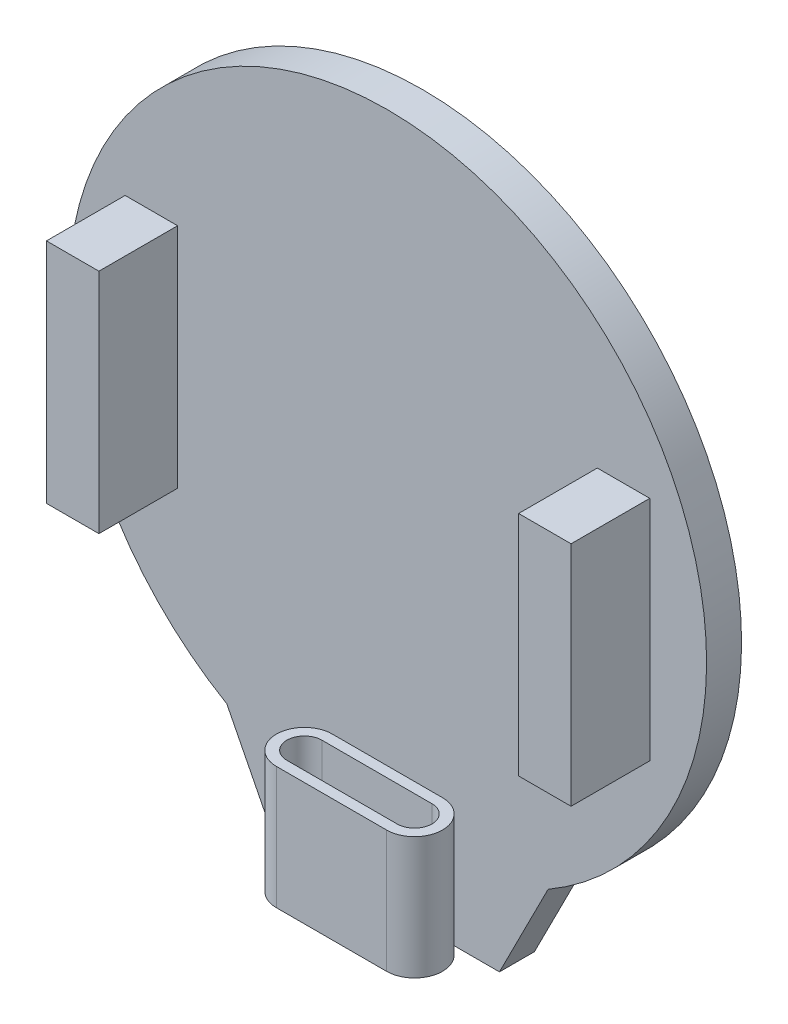
ISO-10303-21;
HEADER;
FILE_DESCRIPTION(('STEP AP214'),'2;1');
FILE_NAME('part.step','',(''),(''),'','','');
FILE_SCHEMA(('AUTOMOTIVE_DESIGN { 1 0 10303 214 1 1 1 1 }'));
ENDSEC;
DATA;
#1=APPLICATION_CONTEXT('core data for automotive mechanical design processes');
#2=APPLICATION_PROTOCOL_DEFINITION('international standard','automotive_design',2000,#1);
#3=PRODUCT_CONTEXT('',#1,'mechanical');
#4=PRODUCT('Part','Part','',(#3));
#5=PRODUCT_RELATED_PRODUCT_CATEGORY('part','',(#4));
#6=PRODUCT_DEFINITION_FORMATION('','',#4);
#7=PRODUCT_DEFINITION_CONTEXT('part definition',#1,'design');
#8=PRODUCT_DEFINITION('design','',#6,#7);
#9=PRODUCT_DEFINITION_SHAPE('','',#8);
#10=(LENGTH_UNIT() NAMED_UNIT(*) SI_UNIT(.MILLI.,.METRE.));
#11=(NAMED_UNIT(*) PLANE_ANGLE_UNIT() SI_UNIT($,.RADIAN.));
#12=(NAMED_UNIT(*) SI_UNIT($,.STERADIAN.) SOLID_ANGLE_UNIT());
#13=UNCERTAINTY_MEASURE_WITH_UNIT(LENGTH_MEASURE(1.E-05),#10,'distance_accuracy_value','');
#14=(GEOMETRIC_REPRESENTATION_CONTEXT(3) GLOBAL_UNCERTAINTY_ASSIGNED_CONTEXT((#13)) GLOBAL_UNIT_ASSIGNED_CONTEXT((#10,
#11,#12)) REPRESENTATION_CONTEXT('',''));
#15=CARTESIAN_POINT('',(0.,0.,0.));
#16=DIRECTION('',(0.,0.,1.));
#17=DIRECTION('',(1.,0.,0.));
#18=AXIS2_PLACEMENT_3D('',#15,#16,#17);
#19=CARTESIAN_POINT('',(0.,0.,2.));
#20=DIRECTION('',(0.,0.,1.));
#21=DIRECTION('',(1.,0.,0.));
#22=AXIS2_PLACEMENT_3D('',#19,#20,#21);
#23=PLANE('',#22);
#24=DIRECTION('',(0.,-1.,0.));
#25=VECTOR('',#24,1.);
#26=CARTESIAN_POINT('',(-3.15,-14.2501704175954,2.));
#27=LINE('',#26,#25);
#28=CARTESIAN_POINT('',(-3.15,-14.2501704175954,2.));
#29=VERTEX_POINT('',#28);
#30=CARTESIAN_POINT('',(-3.15,-21.2501704175954,2.));
#31=VERTEX_POINT('',#30);
#32=EDGE_CURVE('E60',#29,#31,#27,.T.);
#33=ORIENTED_EDGE('',*,*,#32,.F.);
#34=DIRECTION('',(1.,0.,0.));
#35=VECTOR('',#34,1.);
#36=CARTESIAN_POINT('',(-3.15,-14.2501704175954,2.));
#37=LINE('',#36,#35);
#38=CARTESIAN_POINT('',(3.15,-14.2501704175954,2.));
#39=VERTEX_POINT('',#38);
#40=EDGE_CURVE('E55',#29,#39,#37,.T.);
#41=ORIENTED_EDGE('',*,*,#40,.T.);
#42=DIRECTION('',(0.,-1.,0.));
#43=VECTOR('',#42,1.);
#44=CARTESIAN_POINT('',(3.15,-14.2501704175954,2.));
#45=LINE('',#44,#43);
#46=CARTESIAN_POINT('',(3.15,-21.2501704175954,2.));
#47=VERTEX_POINT('',#46);
#48=EDGE_CURVE('E243',#39,#47,#45,.T.);
#49=ORIENTED_EDGE('',*,*,#48,.T.);
#50=DIRECTION('',(1.,0.,0.));
#51=VECTOR('',#50,1.);
#52=CARTESIAN_POINT('',(-6.405,-21.2501704175954,2.));
#53=LINE('',#52,#51);
#54=CARTESIAN_POINT('',(6.405,-21.2501704175954,2.));
#55=VERTEX_POINT('',#54);
#56=EDGE_CURVE('E313',#47,#55,#53,.T.);
#57=ORIENTED_EDGE('',*,*,#56,.T.);
#58=DIRECTION('',(0.452413654491768,0.891808211012549,0.));
#59=VECTOR('',#58,1.);
#60=CARTESIAN_POINT('',(6.405,-21.2501704175954,2.));
#61=LINE('',#60,#59);
#62=CARTESIAN_POINT('',(9.185,-15.7701704175954,2.));
#63=VERTEX_POINT('',#62);
#64=EDGE_CURVE('E316',#55,#63,#61,.T.);
#65=ORIENTED_EDGE('',*,*,#64,.T.);
#66=CARTESIAN_POINT('',(0.,0.,2.));
#67=DIRECTION('',(0.,0.,1.));
#68=DIRECTION('',(1.,0.,0.));
#69=AXIS2_PLACEMENT_3D('',#66,#67,#68);
#70=CIRCLE('',#69,18.25);
#71=CARTESIAN_POINT('',(-9.185,-15.7701704175954,2.));
#72=VERTEX_POINT('',#71);
#73=EDGE_CURVE('E307',#63,#72,#70,.T.);
#74=ORIENTED_EDGE('',*,*,#73,.T.);
#75=DIRECTION('',(0.452413654491768,-0.891808211012549,0.));
#76=VECTOR('',#75,1.);
#77=CARTESIAN_POINT('',(-9.185,-15.7701704175954,2.));
#78=LINE('',#77,#76);
#79=CARTESIAN_POINT('',(-6.405,-21.2501704175954,2.));
#80=VERTEX_POINT('',#79);
#81=EDGE_CURVE('E310',#72,#80,#78,.T.);
#82=ORIENTED_EDGE('',*,*,#81,.T.);
#83=EDGE_CURVE('E314',#80,#31,#53,.T.);
#84=ORIENTED_EDGE('',*,*,#83,.T.);
#85=EDGE_LOOP('',(#33,#41,#49,#57,#65,#74,#82,#84));
#86=FACE_BOUND('',#85,.T.);
#87=DIRECTION('',(-1.,0.,0.));
#88=VECTOR('',#87,1.);
#89=CARTESIAN_POINT('',(15.,6.5,2.));
#90=LINE('',#89,#88);
#91=CARTESIAN_POINT('',(15.,6.5,2.));
#92=VERTEX_POINT('',#91);
#93=CARTESIAN_POINT('',(12.,6.5,2.));
#94=VERTEX_POINT('',#93);
#95=EDGE_CURVE('E293',#92,#94,#90,.T.);
#96=ORIENTED_EDGE('',*,*,#95,.F.);
#97=DIRECTION('',(0.,1.,0.));
#98=VECTOR('',#97,1.);
#99=CARTESIAN_POINT('',(15.,6.5,2.));
#100=LINE('',#99,#98);
#101=CARTESIAN_POINT('',(15.,-6.5,2.));
#102=VERTEX_POINT('',#101);
#103=EDGE_CURVE('E261',#102,#92,#100,.T.);
#104=ORIENTED_EDGE('',*,*,#103,.F.);
#105=DIRECTION('',(1.,0.,0.));
#106=VECTOR('',#105,1.);
#107=CARTESIAN_POINT('',(15.,-6.5,2.));
#108=LINE('',#107,#106);
#109=CARTESIAN_POINT('',(12.,-6.5,2.));
#110=VERTEX_POINT('',#109);
#111=EDGE_CURVE('E287',#110,#102,#108,.T.);
#112=ORIENTED_EDGE('',*,*,#111,.F.);
#113=DIRECTION('',(0.,-1.,0.));
#114=VECTOR('',#113,1.);
#115=CARTESIAN_POINT('',(12.,6.5,2.));
#116=LINE('',#115,#114);
#117=EDGE_CURVE('E289',#94,#110,#116,.T.);
#118=ORIENTED_EDGE('',*,*,#117,.F.);
#119=EDGE_LOOP('',(#96,#104,#112,#118));
#120=FACE_BOUND('',#119,.T.);
#121=DIRECTION('',(1.,0.,0.));
#122=VECTOR('',#121,1.);
#123=CARTESIAN_POINT('',(-15.,-6.5,2.));
#124=LINE('',#123,#122);
#125=CARTESIAN_POINT('',(-15.,-6.5,2.));
#126=VERTEX_POINT('',#125);
#127=CARTESIAN_POINT('',(-12.,-6.5,2.));
#128=VERTEX_POINT('',#127);
#129=EDGE_CURVE('E260',#126,#128,#124,.T.);
#130=ORIENTED_EDGE('',*,*,#129,.F.);
#131=DIRECTION('',(0.,-1.,0.));
#132=VECTOR('',#131,1.);
#133=CARTESIAN_POINT('',(-15.,6.5,2.));
#134=LINE('',#133,#132);
#135=CARTESIAN_POINT('',(-15.,6.5,2.));
#136=VERTEX_POINT('',#135);
#137=EDGE_CURVE('E257',#136,#126,#134,.T.);
#138=ORIENTED_EDGE('',*,*,#137,.F.);
#139=DIRECTION('',(-1.,0.,0.));
#140=VECTOR('',#139,1.);
#141=CARTESIAN_POINT('',(-15.,6.5,2.));
#142=LINE('',#141,#140);
#143=CARTESIAN_POINT('',(-12.,6.5,2.));
#144=VERTEX_POINT('',#143);
#145=EDGE_CURVE('E250',#144,#136,#142,.T.);
#146=ORIENTED_EDGE('',*,*,#145,.F.);
#147=DIRECTION('',(0.,1.,0.));
#148=VECTOR('',#147,1.);
#149=CARTESIAN_POINT('',(-12.,6.5,2.));
#150=LINE('',#149,#148);
#151=EDGE_CURVE('E263',#128,#144,#150,.T.);
#152=ORIENTED_EDGE('',*,*,#151,.F.);
#153=EDGE_LOOP('',(#130,#138,#146,#152));
#154=FACE_BOUND('',#153,.T.);
#155=ADVANCED_FACE('F39',(#86,#120,#154),#23,.T.);
#156=CARTESIAN_POINT('',(0.,0.,2.));
#157=DIRECTION('',(0.,0.,-1.));
#158=DIRECTION('',(-1.,0.,0.));
#159=AXIS2_PLACEMENT_3D('',#156,#157,#158);
#160=CYLINDRICAL_SURFACE('',#159,18.25);
#161=CARTESIAN_POINT('',(0.,0.,0.));
#162=DIRECTION('',(0.,0.,1.));
#163=DIRECTION('',(1.,0.,0.));
#164=AXIS2_PLACEMENT_3D('',#161,#162,#163);
#165=CIRCLE('',#164,18.25);
#166=CARTESIAN_POINT('',(9.185,-15.7701704175954,0.));
#167=VERTEX_POINT('',#166);
#168=CARTESIAN_POINT('',(-9.185,-15.7701704175954,0.));
#169=VERTEX_POINT('',#168);
#170=EDGE_CURVE('E305',#167,#169,#165,.T.);
#171=ORIENTED_EDGE('',*,*,#170,.T.);
#172=DIRECTION('',(0.,0.,-1.));
#173=VECTOR('',#172,1.);
#174=CARTESIAN_POINT('',(-9.185,-15.7701704175954,2.));
#175=LINE('',#174,#173);
#176=EDGE_CURVE('E43',#72,#169,#175,.T.);
#177=ORIENTED_EDGE('',*,*,#176,.F.);
#178=ORIENTED_EDGE('',*,*,#73,.F.);
#179=DIRECTION('',(0.,0.,-1.));
#180=VECTOR('',#179,1.);
#181=CARTESIAN_POINT('',(9.185,-15.7701704175954,2.));
#182=LINE('',#181,#180);
#183=EDGE_CURVE('E318',#63,#167,#182,.T.);
#184=ORIENTED_EDGE('',*,*,#183,.T.);
#185=EDGE_LOOP('',(#171,#177,#178,#184));
#186=FACE_BOUND('',#185,.T.);
#187=ADVANCED_FACE('F41',(#186),#160,.T.);
#188=CARTESIAN_POINT('',(-9.185,-15.7701704175954,2.));
#189=DIRECTION('',(0.891808211012549,0.452413654491768,0.));
#190=DIRECTION('',(-0.452413654491768,0.891808211012549,0.));
#191=AXIS2_PLACEMENT_3D('',#188,#189,#190);
#192=PLANE('',#191);
#193=DIRECTION('',(0.452413654491768,-0.891808211012549,0.));
#194=VECTOR('',#193,1.);
#195=CARTESIAN_POINT('',(-9.185,-15.7701704175954,0.));
#196=LINE('',#195,#194);
#197=CARTESIAN_POINT('',(-6.405,-21.2501704175954,0.));
#198=VERTEX_POINT('',#197);
#199=EDGE_CURVE('E321',#169,#198,#196,.T.);
#200=ORIENTED_EDGE('',*,*,#199,.T.);
#201=DIRECTION('',(0.,0.,-1.));
#202=VECTOR('',#201,1.);
#203=CARTESIAN_POINT('',(-6.405,-21.2501704175954,2.));
#204=LINE('',#203,#202);
#205=EDGE_CURVE('E330',#80,#198,#204,.T.);
#206=ORIENTED_EDGE('',*,*,#205,.F.);
#207=ORIENTED_EDGE('',*,*,#81,.F.);
#208=ORIENTED_EDGE('',*,*,#176,.T.);
#209=EDGE_LOOP('',(#200,#206,#207,#208));
#210=FACE_BOUND('',#209,.T.);
#211=ADVANCED_FACE('F339',(#210),#192,.F.);
#212=CARTESIAN_POINT('',(-6.405,-21.2501704175954,2.));
#213=DIRECTION('',(0.,1.,0.));
#214=DIRECTION('',(0.,0.,1.));
#215=AXIS2_PLACEMENT_3D('',#212,#213,#214);
#216=PLANE('',#215);
#217=DIRECTION('',(1.,0.,0.));
#218=VECTOR('',#217,1.);
#219=CARTESIAN_POINT('',(-6.405,-21.2501704175954,0.));
#220=LINE('',#219,#218);
#221=CARTESIAN_POINT('',(6.405,-21.2501704175954,0.));
#222=VERTEX_POINT('',#221);
#223=EDGE_CURVE('E323',#198,#222,#220,.T.);
#224=ORIENTED_EDGE('',*,*,#223,.T.);
#225=DIRECTION('',(0.,0.,-1.));
#226=VECTOR('',#225,1.);
#227=CARTESIAN_POINT('',(6.405,-21.2501704175954,2.));
#228=LINE('',#227,#226);
#229=EDGE_CURVE('E328',#55,#222,#228,.T.);
#230=ORIENTED_EDGE('',*,*,#229,.F.);
#231=ORIENTED_EDGE('',*,*,#56,.F.);
#232=CARTESIAN_POINT('',(3.15,-21.2501704175954,3.6));
#233=DIRECTION('',(0.,-1.,0.));
#234=DIRECTION('',(0.,0.,-1.));
#235=AXIS2_PLACEMENT_3D('',#232,#233,#234);
#236=CIRCLE('',#235,1.6);
#237=CARTESIAN_POINT('',(3.15,-21.2501704175954,5.2));
#238=VERTEX_POINT('',#237);
#239=EDGE_CURVE('E233',#47,#238,#236,.T.);
#240=ORIENTED_EDGE('',*,*,#239,.T.);
#241=DIRECTION('',(-1.,0.,0.));
#242=VECTOR('',#241,1.);
#243=CARTESIAN_POINT('',(-3.15,-21.2501704175954,5.2));
#244=LINE('',#243,#242);
#245=CARTESIAN_POINT('',(-3.15,-21.2501704175954,5.2));
#246=VERTEX_POINT('',#245);
#247=EDGE_CURVE('E223',#238,#246,#244,.T.);
#248=ORIENTED_EDGE('',*,*,#247,.T.);
#249=CARTESIAN_POINT('',(-3.15,-21.2501704175954,3.6));
#250=DIRECTION('',(0.,-1.,0.));
#251=DIRECTION('',(0.,0.,-1.));
#252=AXIS2_PLACEMENT_3D('',#249,#250,#251);
#253=CIRCLE('',#252,1.6);
#254=EDGE_CURVE('E216',#246,#31,#253,.T.);
#255=ORIENTED_EDGE('',*,*,#254,.T.);
#256=ORIENTED_EDGE('',*,*,#83,.F.);
#257=ORIENTED_EDGE('',*,*,#205,.T.);
#258=EDGE_LOOP('',(#224,#230,#231,#240,#248,#255,#256,#257));
#259=FACE_BOUND('',#258,.T.);
#260=CARTESIAN_POINT('',(-3.15,-21.2501704175954,3.6));
#261=DIRECTION('',(0.,-1.,0.));
#262=DIRECTION('',(0.,0.,-1.));
#263=AXIS2_PLACEMENT_3D('',#260,#261,#262);
#264=CIRCLE('',#263,1.);
#265=CARTESIAN_POINT('',(-3.15,-21.2501704175954,4.6));
#266=VERTEX_POINT('',#265);
#267=CARTESIAN_POINT('',(-3.15,-21.2501704175954,2.6));
#268=VERTEX_POINT('',#267);
#269=EDGE_CURVE('E183',#266,#268,#264,.T.);
#270=ORIENTED_EDGE('',*,*,#269,.F.);
#271=DIRECTION('',(-1.,0.,0.));
#272=VECTOR('',#271,1.);
#273=CARTESIAN_POINT('',(-3.15,-21.2501704175954,4.6));
#274=LINE('',#273,#272);
#275=CARTESIAN_POINT('',(3.15,-21.2501704175954,4.6));
#276=VERTEX_POINT('',#275);
#277=EDGE_CURVE('E201',#276,#266,#274,.T.);
#278=ORIENTED_EDGE('',*,*,#277,.F.);
#279=CARTESIAN_POINT('',(3.15,-21.2501704175954,3.6));
#280=DIRECTION('',(0.,-1.,0.));
#281=DIRECTION('',(0.,0.,-1.));
#282=AXIS2_PLACEMENT_3D('',#279,#280,#281);
#283=CIRCLE('',#282,1.);
#284=CARTESIAN_POINT('',(3.15,-21.2501704175954,2.6));
#285=VERTEX_POINT('',#284);
#286=EDGE_CURVE('E204',#285,#276,#283,.T.);
#287=ORIENTED_EDGE('',*,*,#286,.F.);
#288=DIRECTION('',(1.,0.,0.));
#289=VECTOR('',#288,1.);
#290=CARTESIAN_POINT('',(-3.15,-21.2501704175954,2.6));
#291=LINE('',#290,#289);
#292=EDGE_CURVE('E210',#268,#285,#291,.T.);
#293=ORIENTED_EDGE('',*,*,#292,.F.);
#294=EDGE_LOOP('',(#270,#278,#287,#293));
#295=FACE_BOUND('',#294,.T.);
#296=ADVANCED_FACE('F348',(#259,#295),#216,.F.);
#297=CARTESIAN_POINT('',(6.405,-21.2501704175954,2.));
#298=DIRECTION('',(-0.891808211012549,0.452413654491768,0.));
#299=DIRECTION('',(-0.452413654491768,-0.891808211012549,0.));
#300=AXIS2_PLACEMENT_3D('',#297,#298,#299);
#301=PLANE('',#300);
#302=DIRECTION('',(0.452413654491768,0.891808211012549,0.));
#303=VECTOR('',#302,1.);
#304=CARTESIAN_POINT('',(6.405,-21.2501704175954,0.));
#305=LINE('',#304,#303);
#306=EDGE_CURVE('E311',#222,#167,#305,.T.);
#307=ORIENTED_EDGE('',*,*,#306,.T.);
#308=ORIENTED_EDGE('',*,*,#183,.F.);
#309=ORIENTED_EDGE('',*,*,#64,.F.);
#310=ORIENTED_EDGE('',*,*,#229,.T.);
#311=EDGE_LOOP('',(#307,#308,#309,#310));
#312=FACE_BOUND('',#311,.T.);
#313=ADVANCED_FACE('F352',(#312),#301,.F.);
#314=CARTESIAN_POINT('',(0.,0.,0.));
#315=DIRECTION('',(0.,0.,1.));
#316=DIRECTION('',(1.,0.,0.));
#317=AXIS2_PLACEMENT_3D('',#314,#315,#316);
#318=PLANE('',#317);
#319=CARTESIAN_POINT('',(0.,0.,0.));
#320=DIRECTION('',(0.,0.,-1.));
#321=DIRECTION('',(-1.,0.,0.));
#322=AXIS2_PLACEMENT_3D('',#319,#320,#321);
#323=CIRCLE('',#322,16.2);
#324=CARTESIAN_POINT('',(-16.2,0.,0.));
#325=VERTEX_POINT('',#324);
#326=EDGE_CURVE('E11',#325,#325,#323,.T.);
#327=ORIENTED_EDGE('',*,*,#326,.F.);
#328=EDGE_LOOP('',(#327));
#329=FACE_BOUND('',#328,.T.);
#330=ORIENTED_EDGE('',*,*,#170,.F.);
#331=ORIENTED_EDGE('',*,*,#306,.F.);
#332=ORIENTED_EDGE('',*,*,#223,.F.);
#333=ORIENTED_EDGE('',*,*,#199,.F.);
#334=EDGE_LOOP('',(#330,#331,#332,#333));
#335=FACE_BOUND('',#334,.T.);
#336=ADVANCED_FACE('F346',(#329,#335),#318,.F.);
#337=CARTESIAN_POINT('',(0.,0.,-1.4));
#338=DIRECTION('',(0.,0.,1.));
#339=DIRECTION('',(1.,0.,0.));
#340=AXIS2_PLACEMENT_3D('',#337,#338,#339);
#341=CYLINDRICAL_SURFACE('',#340,16.2);
#342=CARTESIAN_POINT('',(0.,0.,-1.4));
#343=DIRECTION('',(0.,0.,-1.));
#344=DIRECTION('',(-1.,0.,0.));
#345=AXIS2_PLACEMENT_3D('',#342,#343,#344);
#346=CIRCLE('',#345,16.2);
#347=CARTESIAN_POINT('',(-16.2,0.,-1.4));
#348=VERTEX_POINT('',#347);
#349=EDGE_CURVE('E276',#348,#348,#346,.T.);
#350=ORIENTED_EDGE('',*,*,#349,.F.);
#351=EDGE_LOOP('',(#350));
#352=FACE_BOUND('',#351,.T.);
#353=ORIENTED_EDGE('',*,*,#326,.T.);
#354=EDGE_LOOP('',(#353));
#355=FACE_BOUND('',#354,.T.);
#356=ADVANCED_FACE('F384',(#352,#355),#341,.T.);
#357=CARTESIAN_POINT('',(0.,0.,-1.4));
#358=DIRECTION('',(0.,0.,-1.));
#359=DIRECTION('',(-1.,0.,0.));
#360=AXIS2_PLACEMENT_3D('',#357,#358,#359);
#361=PLANE('',#360);
#362=ORIENTED_EDGE('',*,*,#349,.T.);
#363=EDGE_LOOP('',(#362));
#364=FACE_BOUND('',#363,.T.);
#365=ADVANCED_FACE('F414',(#364),#361,.T.);
#366=CARTESIAN_POINT('',(15.,6.5,6.5));
#367=DIRECTION('',(-1.,0.,0.));
#368=DIRECTION('',(0.,0.,1.));
#369=AXIS2_PLACEMENT_3D('',#366,#367,#368);
#370=PLANE('',#369);
#371=ORIENTED_EDGE('',*,*,#103,.T.);
#372=DIRECTION('',(0.,0.,-1.));
#373=VECTOR('',#372,1.);
#374=CARTESIAN_POINT('',(15.,6.5,6.5));
#375=LINE('',#374,#373);
#376=CARTESIAN_POINT('',(15.,6.5,6.5));
#377=VERTEX_POINT('',#376);
#378=EDGE_CURVE('E240',#377,#92,#375,.T.);
#379=ORIENTED_EDGE('',*,*,#378,.F.);
#380=DIRECTION('',(0.,1.,0.));
#381=VECTOR('',#380,1.);
#382=CARTESIAN_POINT('',(15.,6.5,6.5));
#383=LINE('',#382,#381);
#384=CARTESIAN_POINT('',(15.,-6.5,6.5));
#385=VERTEX_POINT('',#384);
#386=EDGE_CURVE('E290',#385,#377,#383,.T.);
#387=ORIENTED_EDGE('',*,*,#386,.F.);
#388=DIRECTION('',(0.,0.,-1.));
#389=VECTOR('',#388,1.);
#390=CARTESIAN_POINT('',(15.,-6.5,6.5));
#391=LINE('',#390,#389);
#392=EDGE_CURVE('E283',#385,#102,#391,.T.);
#393=ORIENTED_EDGE('',*,*,#392,.T.);
#394=EDGE_LOOP('',(#371,#379,#387,#393));
#395=FACE_BOUND('',#394,.T.);
#396=ADVANCED_FACE('F422',(#395),#370,.F.);
#397=CARTESIAN_POINT('',(15.,6.5,6.5));
#398=DIRECTION('',(0.,-1.,0.));
#399=DIRECTION('',(0.,0.,-1.));
#400=AXIS2_PLACEMENT_3D('',#397,#398,#399);
#401=PLANE('',#400);
#402=ORIENTED_EDGE('',*,*,#95,.T.);
#403=DIRECTION('',(0.,0.,-1.));
#404=VECTOR('',#403,1.);
#405=CARTESIAN_POINT('',(12.,6.5,6.5));
#406=LINE('',#405,#404);
#407=CARTESIAN_POINT('',(12.,6.5,6.5));
#408=VERTEX_POINT('',#407);
#409=EDGE_CURVE('E278',#408,#94,#406,.T.);
#410=ORIENTED_EDGE('',*,*,#409,.F.);
#411=DIRECTION('',(-1.,0.,0.));
#412=VECTOR('',#411,1.);
#413=CARTESIAN_POINT('',(15.,6.5,6.5));
#414=LINE('',#413,#412);
#415=EDGE_CURVE('E300',#377,#408,#414,.T.);
#416=ORIENTED_EDGE('',*,*,#415,.F.);
#417=ORIENTED_EDGE('',*,*,#378,.T.);
#418=EDGE_LOOP('',(#402,#410,#416,#417));
#419=FACE_BOUND('',#418,.T.);
#420=ADVANCED_FACE('F430',(#419),#401,.F.);
#421=CARTESIAN_POINT('',(12.,6.5,6.5));
#422=DIRECTION('',(1.,0.,0.));
#423=DIRECTION('',(0.,0.,-1.));
#424=AXIS2_PLACEMENT_3D('',#421,#422,#423);
#425=PLANE('',#424);
#426=ORIENTED_EDGE('',*,*,#117,.T.);
#427=DIRECTION('',(0.,0.,-1.));
#428=VECTOR('',#427,1.);
#429=CARTESIAN_POINT('',(12.,-6.5,6.5));
#430=LINE('',#429,#428);
#431=CARTESIAN_POINT('',(12.,-6.5,6.5));
#432=VERTEX_POINT('',#431);
#433=EDGE_CURVE('E281',#432,#110,#430,.T.);
#434=ORIENTED_EDGE('',*,*,#433,.F.);
#435=DIRECTION('',(0.,-1.,0.));
#436=VECTOR('',#435,1.);
#437=CARTESIAN_POINT('',(12.,6.5,6.5));
#438=LINE('',#437,#436);
#439=EDGE_CURVE('E298',#408,#432,#438,.T.);
#440=ORIENTED_EDGE('',*,*,#439,.F.);
#441=ORIENTED_EDGE('',*,*,#409,.T.);
#442=EDGE_LOOP('',(#426,#434,#440,#441));
#443=FACE_BOUND('',#442,.T.);
#444=ADVANCED_FACE('F439',(#443),#425,.F.);
#445=CARTESIAN_POINT('',(15.,-6.5,6.5));
#446=DIRECTION('',(0.,1.,0.));
#447=DIRECTION('',(0.,0.,1.));
#448=AXIS2_PLACEMENT_3D('',#445,#446,#447);
#449=PLANE('',#448);
#450=ORIENTED_EDGE('',*,*,#111,.T.);
#451=ORIENTED_EDGE('',*,*,#392,.F.);
#452=DIRECTION('',(1.,0.,0.));
#453=VECTOR('',#452,1.);
#454=CARTESIAN_POINT('',(15.,-6.5,6.5));
#455=LINE('',#454,#453);
#456=EDGE_CURVE('E286',#432,#385,#455,.T.);
#457=ORIENTED_EDGE('',*,*,#456,.F.);
#458=ORIENTED_EDGE('',*,*,#433,.T.);
#459=EDGE_LOOP('',(#450,#451,#457,#458));
#460=FACE_BOUND('',#459,.T.);
#461=ADVANCED_FACE('F448',(#460),#449,.F.);
#462=CARTESIAN_POINT('',(0.,0.,6.5));
#463=DIRECTION('',(0.,0.,-1.));
#464=DIRECTION('',(-1.,0.,0.));
#465=AXIS2_PLACEMENT_3D('',#462,#463,#464);
#466=PLANE('',#465);
#467=ORIENTED_EDGE('',*,*,#386,.T.);
#468=ORIENTED_EDGE('',*,*,#415,.T.);
#469=ORIENTED_EDGE('',*,*,#439,.T.);
#470=ORIENTED_EDGE('',*,*,#456,.T.);
#471=EDGE_LOOP('',(#467,#468,#469,#470));
#472=FACE_BOUND('',#471,.T.);
#473=ADVANCED_FACE('F457',(#472),#466,.F.);
#474=CARTESIAN_POINT('',(-15.,6.5,6.5));
#475=DIRECTION('',(1.,0.,0.));
#476=DIRECTION('',(0.,0.,-1.));
#477=AXIS2_PLACEMENT_3D('',#474,#475,#476);
#478=PLANE('',#477);
#479=ORIENTED_EDGE('',*,*,#137,.T.);
#480=DIRECTION('',(0.,0.,-1.));
#481=VECTOR('',#480,1.);
#482=CARTESIAN_POINT('',(-15.,-6.5,6.5));
#483=LINE('',#482,#481);
#484=CARTESIAN_POINT('',(-15.,-6.5,6.5));
#485=VERTEX_POINT('',#484);
#486=EDGE_CURVE('E274',#485,#126,#483,.T.);
#487=ORIENTED_EDGE('',*,*,#486,.F.);
#488=DIRECTION('',(0.,-1.,0.));
#489=VECTOR('',#488,1.);
#490=CARTESIAN_POINT('',(-15.,6.5,6.5));
#491=LINE('',#490,#489);
#492=CARTESIAN_POINT('',(-15.,6.5,6.5));
#493=VERTEX_POINT('',#492);
#494=EDGE_CURVE('E246',#493,#485,#491,.T.);
#495=ORIENTED_EDGE('',*,*,#494,.F.);
#496=DIRECTION('',(0.,0.,-1.));
#497=VECTOR('',#496,1.);
#498=CARTESIAN_POINT('',(-15.,6.5,6.5));
#499=LINE('',#498,#497);
#500=EDGE_CURVE('E256',#493,#136,#499,.T.);
#501=ORIENTED_EDGE('',*,*,#500,.T.);
#502=EDGE_LOOP('',(#479,#487,#495,#501));
#503=FACE_BOUND('',#502,.T.);
#504=ADVANCED_FACE('F466',(#503),#478,.F.);
#505=CARTESIAN_POINT('',(-15.,-6.5,6.5));
#506=DIRECTION('',(0.,1.,0.));
#507=DIRECTION('',(0.,0.,1.));
#508=AXIS2_PLACEMENT_3D('',#505,#506,#507);
#509=PLANE('',#508);
#510=ORIENTED_EDGE('',*,*,#129,.T.);
#511=DIRECTION('',(0.,0.,-1.));
#512=VECTOR('',#511,1.);
#513=CARTESIAN_POINT('',(-12.,-6.5,6.5));
#514=LINE('',#513,#512);
#515=CARTESIAN_POINT('',(-12.,-6.5,6.5));
#516=VERTEX_POINT('',#515);
#517=EDGE_CURVE('E271',#516,#128,#514,.T.);
#518=ORIENTED_EDGE('',*,*,#517,.F.);
#519=DIRECTION('',(1.,0.,0.));
#520=VECTOR('',#519,1.);
#521=CARTESIAN_POINT('',(-15.,-6.5,6.5));
#522=LINE('',#521,#520);
#523=EDGE_CURVE('E249',#485,#516,#522,.T.);
#524=ORIENTED_EDGE('',*,*,#523,.F.);
#525=ORIENTED_EDGE('',*,*,#486,.T.);
#526=EDGE_LOOP('',(#510,#518,#524,#525));
#527=FACE_BOUND('',#526,.T.);
#528=ADVANCED_FACE('F475',(#527),#509,.F.);
#529=CARTESIAN_POINT('',(-12.,6.5,6.5));
#530=DIRECTION('',(-1.,0.,0.));
#531=DIRECTION('',(0.,0.,1.));
#532=AXIS2_PLACEMENT_3D('',#529,#530,#531);
#533=PLANE('',#532);
#534=ORIENTED_EDGE('',*,*,#151,.T.);
#535=DIRECTION('',(0.,0.,-1.));
#536=VECTOR('',#535,1.);
#537=CARTESIAN_POINT('',(-12.,6.5,6.5));
#538=LINE('',#537,#536);
#539=CARTESIAN_POINT('',(-12.,6.5,6.5));
#540=VERTEX_POINT('',#539);
#541=EDGE_CURVE('E269',#540,#144,#538,.T.);
#542=ORIENTED_EDGE('',*,*,#541,.F.);
#543=DIRECTION('',(0.,1.,0.));
#544=VECTOR('',#543,1.);
#545=CARTESIAN_POINT('',(-12.,6.5,6.5));
#546=LINE('',#545,#544);
#547=EDGE_CURVE('E252',#516,#540,#546,.T.);
#548=ORIENTED_EDGE('',*,*,#547,.F.);
#549=ORIENTED_EDGE('',*,*,#517,.T.);
#550=EDGE_LOOP('',(#534,#542,#548,#549));
#551=FACE_BOUND('',#550,.T.);
#552=ADVANCED_FACE('F484',(#551),#533,.F.);
#553=CARTESIAN_POINT('',(-15.,6.5,6.5));
#554=DIRECTION('',(0.,-1.,0.));
#555=DIRECTION('',(0.,0.,-1.));
#556=AXIS2_PLACEMENT_3D('',#553,#554,#555);
#557=PLANE('',#556);
#558=ORIENTED_EDGE('',*,*,#145,.T.);
#559=ORIENTED_EDGE('',*,*,#500,.F.);
#560=DIRECTION('',(-1.,0.,0.));
#561=VECTOR('',#560,1.);
#562=CARTESIAN_POINT('',(-15.,6.5,6.5));
#563=LINE('',#562,#561);
#564=EDGE_CURVE('E254',#540,#493,#563,.T.);
#565=ORIENTED_EDGE('',*,*,#564,.F.);
#566=ORIENTED_EDGE('',*,*,#541,.T.);
#567=EDGE_LOOP('',(#558,#559,#565,#566));
#568=FACE_BOUND('',#567,.T.);
#569=ADVANCED_FACE('F493',(#568),#557,.F.);
#570=CARTESIAN_POINT('',(0.,0.,6.5));
#571=DIRECTION('',(0.,0.,1.));
#572=DIRECTION('',(1.,0.,0.));
#573=AXIS2_PLACEMENT_3D('',#570,#571,#572);
#574=PLANE('',#573);
#575=ORIENTED_EDGE('',*,*,#494,.T.);
#576=ORIENTED_EDGE('',*,*,#523,.T.);
#577=ORIENTED_EDGE('',*,*,#547,.T.);
#578=ORIENTED_EDGE('',*,*,#564,.T.);
#579=EDGE_LOOP('',(#575,#576,#577,#578));
#580=FACE_BOUND('',#579,.T.);
#581=ADVANCED_FACE('F501',(#580),#574,.T.);
#582=CARTESIAN_POINT('',(-3.15,-14.2501704175954,3.6));
#583=DIRECTION('',(0.,-1.,0.));
#584=DIRECTION('',(0.,0.,-1.));
#585=AXIS2_PLACEMENT_3D('',#582,#583,#584);
#586=CYLINDRICAL_SURFACE('',#585,1.6);
#587=ORIENTED_EDGE('',*,*,#254,.F.);
#588=DIRECTION('',(0.,-1.,0.));
#589=VECTOR('',#588,1.);
#590=CARTESIAN_POINT('',(-3.15,-14.2501704175954,5.2));
#591=LINE('',#590,#589);
#592=CARTESIAN_POINT('',(-3.15,-14.2501704175954,5.2));
#593=VERTEX_POINT('',#592);
#594=EDGE_CURVE('E238',#593,#246,#591,.T.);
#595=ORIENTED_EDGE('',*,*,#594,.F.);
#596=CARTESIAN_POINT('',(-3.15,-14.2501704175954,3.6));
#597=DIRECTION('',(0.,-1.,0.));
#598=DIRECTION('',(0.,0.,-1.));
#599=AXIS2_PLACEMENT_3D('',#596,#597,#598);
#600=CIRCLE('',#599,1.6);
#601=EDGE_CURVE('E220',#593,#29,#600,.T.);
#602=ORIENTED_EDGE('',*,*,#601,.T.);
#603=ORIENTED_EDGE('',*,*,#32,.T.);
#604=EDGE_LOOP('',(#587,#595,#602,#603));
#605=FACE_BOUND('',#604,.T.);
#606=ADVANCED_FACE('F363',(#605),#586,.T.);
#607=CARTESIAN_POINT('',(-3.15,-14.2501704175954,5.2));
#608=DIRECTION('',(0.,0.,1.));
#609=DIRECTION('',(1.,0.,0.));
#610=AXIS2_PLACEMENT_3D('',#607,#608,#609);
#611=PLANE('',#610);
#612=ORIENTED_EDGE('',*,*,#247,.F.);
#613=DIRECTION('',(0.,-1.,0.));
#614=VECTOR('',#613,1.);
#615=CARTESIAN_POINT('',(3.15,-14.2501704175954,5.2));
#616=LINE('',#615,#614);
#617=CARTESIAN_POINT('',(3.15,-14.2501704175954,5.2));
#618=VERTEX_POINT('',#617);
#619=EDGE_CURVE('E241',#618,#238,#616,.T.);
#620=ORIENTED_EDGE('',*,*,#619,.F.);
#621=DIRECTION('',(-1.,0.,0.));
#622=VECTOR('',#621,1.);
#623=CARTESIAN_POINT('',(-3.15,-14.2501704175954,5.2));
#624=LINE('',#623,#622);
#625=EDGE_CURVE('E228',#618,#593,#624,.T.);
#626=ORIENTED_EDGE('',*,*,#625,.T.);
#627=ORIENTED_EDGE('',*,*,#594,.T.);
#628=EDGE_LOOP('',(#612,#620,#626,#627));
#629=FACE_BOUND('',#628,.T.);
#630=ADVANCED_FACE('F358',(#629),#611,.T.);
#631=CARTESIAN_POINT('',(3.15,-14.2501704175954,3.6));
#632=DIRECTION('',(0.,-1.,0.));
#633=DIRECTION('',(0.,0.,-1.));
#634=AXIS2_PLACEMENT_3D('',#631,#632,#633);
#635=CYLINDRICAL_SURFACE('',#634,1.6);
#636=ORIENTED_EDGE('',*,*,#239,.F.);
#637=ORIENTED_EDGE('',*,*,#48,.F.);
#638=CARTESIAN_POINT('',(3.15,-14.2501704175954,3.6));
#639=DIRECTION('',(0.,-1.,0.));
#640=DIRECTION('',(0.,0.,-1.));
#641=AXIS2_PLACEMENT_3D('',#638,#639,#640);
#642=CIRCLE('',#641,1.6);
#643=EDGE_CURVE('E225',#39,#618,#642,.T.);
#644=ORIENTED_EDGE('',*,*,#643,.T.);
#645=ORIENTED_EDGE('',*,*,#619,.T.);
#646=EDGE_LOOP('',(#636,#637,#644,#645));
#647=FACE_BOUND('',#646,.T.);
#648=ADVANCED_FACE('F365',(#647),#635,.T.);
#649=CARTESIAN_POINT('',(-3.15,-14.2501704175954,3.6));
#650=DIRECTION('',(0.,-1.,0.));
#651=DIRECTION('',(0.,0.,-1.));
#652=AXIS2_PLACEMENT_3D('',#649,#650,#651);
#653=PLANE('',#652);
#654=DIRECTION('',(-1.,0.,0.));
#655=VECTOR('',#654,1.);
#656=CARTESIAN_POINT('',(-3.15,-14.2501704175954,4.6));
#657=LINE('',#656,#655);
#658=CARTESIAN_POINT('',(3.15,-14.2501704175954,4.6));
#659=VERTEX_POINT('',#658);
#660=CARTESIAN_POINT('',(-3.15,-14.2501704175954,4.6));
#661=VERTEX_POINT('',#660);
#662=EDGE_CURVE('E188',#659,#661,#657,.T.);
#663=ORIENTED_EDGE('',*,*,#662,.T.);
#664=CARTESIAN_POINT('',(-3.15,-14.2501704175954,3.6));
#665=DIRECTION('',(0.,-1.,0.));
#666=DIRECTION('',(0.,0.,-1.));
#667=AXIS2_PLACEMENT_3D('',#664,#665,#666);
#668=CIRCLE('',#667,1.);
#669=CARTESIAN_POINT('',(-3.15,-14.2501704175954,2.6));
#670=VERTEX_POINT('',#669);
#671=EDGE_CURVE('E180',#661,#670,#668,.T.);
#672=ORIENTED_EDGE('',*,*,#671,.T.);
#673=DIRECTION('',(1.,0.,0.));
#674=VECTOR('',#673,1.);
#675=CARTESIAN_POINT('',(-3.15,-14.2501704175954,2.6));
#676=LINE('',#675,#674);
#677=CARTESIAN_POINT('',(3.15,-14.2501704175954,2.6));
#678=VERTEX_POINT('',#677);
#679=EDGE_CURVE('E192',#670,#678,#676,.T.);
#680=ORIENTED_EDGE('',*,*,#679,.T.);
#681=CARTESIAN_POINT('',(3.15,-14.2501704175954,3.6));
#682=DIRECTION('',(0.,-1.,0.));
#683=DIRECTION('',(0.,0.,-1.));
#684=AXIS2_PLACEMENT_3D('',#681,#682,#683);
#685=CIRCLE('',#684,1.);
#686=EDGE_CURVE('E196',#678,#659,#685,.T.);
#687=ORIENTED_EDGE('',*,*,#686,.T.);
#688=EDGE_LOOP('',(#663,#672,#680,#687));
#689=FACE_BOUND('',#688,.T.);
#690=ORIENTED_EDGE('',*,*,#601,.F.);
#691=ORIENTED_EDGE('',*,*,#625,.F.);
#692=ORIENTED_EDGE('',*,*,#643,.F.);
#693=ORIENTED_EDGE('',*,*,#40,.F.);
#694=EDGE_LOOP('',(#690,#691,#692,#693));
#695=FACE_BOUND('',#694,.T.);
#696=ADVANCED_FACE('F198',(#689,#695),#653,.F.);
#697=CARTESIAN_POINT('',(-3.15,-14.2501704175954,3.6));
#698=DIRECTION('',(0.,-1.,0.));
#699=DIRECTION('',(0.,0.,-1.));
#700=AXIS2_PLACEMENT_3D('',#697,#698,#699);
#701=CYLINDRICAL_SURFACE('',#700,1.);
#702=ORIENTED_EDGE('',*,*,#269,.T.);
#703=DIRECTION('',(0.,-1.,0.));
#704=VECTOR('',#703,1.);
#705=CARTESIAN_POINT('',(-3.15,-14.2501704175954,2.6));
#706=LINE('',#705,#704);
#707=EDGE_CURVE('E176',#670,#268,#706,.T.);
#708=ORIENTED_EDGE('',*,*,#707,.F.);
#709=ORIENTED_EDGE('',*,*,#671,.F.);
#710=DIRECTION('',(0.,-1.,0.));
#711=VECTOR('',#710,1.);
#712=CARTESIAN_POINT('',(-3.15,-14.2501704175954,4.6));
#713=LINE('',#712,#711);
#714=EDGE_CURVE('E214',#661,#266,#713,.T.);
#715=ORIENTED_EDGE('',*,*,#714,.T.);
#716=EDGE_LOOP('',(#702,#708,#709,#715));
#717=FACE_BOUND('',#716,.T.);
#718=ADVANCED_FACE('F178',(#717),#701,.F.);
#719=CARTESIAN_POINT('',(-3.15,-14.2501704175954,4.6));
#720=DIRECTION('',(0.,0.,1.));
#721=DIRECTION('',(1.,0.,0.));
#722=AXIS2_PLACEMENT_3D('',#719,#720,#721);
#723=PLANE('',#722);
#724=ORIENTED_EDGE('',*,*,#277,.T.);
#725=ORIENTED_EDGE('',*,*,#714,.F.);
#726=ORIENTED_EDGE('',*,*,#662,.F.);
#727=DIRECTION('',(0.,-1.,0.));
#728=VECTOR('',#727,1.);
#729=CARTESIAN_POINT('',(3.15,-14.2501704175954,4.6));
#730=LINE('',#729,#728);
#731=EDGE_CURVE('E217',#659,#276,#730,.T.);
#732=ORIENTED_EDGE('',*,*,#731,.T.);
#733=EDGE_LOOP('',(#724,#725,#726,#732));
#734=FACE_BOUND('',#733,.T.);
#735=ADVANCED_FACE('F551',(#734),#723,.F.);
#736=CARTESIAN_POINT('',(3.15,-14.2501704175954,3.6));
#737=DIRECTION('',(0.,-1.,0.));
#738=DIRECTION('',(0.,0.,-1.));
#739=AXIS2_PLACEMENT_3D('',#736,#737,#738);
#740=CYLINDRICAL_SURFACE('',#739,1.);
#741=ORIENTED_EDGE('',*,*,#286,.T.);
#742=ORIENTED_EDGE('',*,*,#731,.F.);
#743=ORIENTED_EDGE('',*,*,#686,.F.);
#744=DIRECTION('',(0.,-1.,0.));
#745=VECTOR('',#744,1.);
#746=CARTESIAN_POINT('',(3.15,-14.2501704175954,2.6));
#747=LINE('',#746,#745);
#748=EDGE_CURVE('E187',#678,#285,#747,.T.);
#749=ORIENTED_EDGE('',*,*,#748,.T.);
#750=EDGE_LOOP('',(#741,#742,#743,#749));
#751=FACE_BOUND('',#750,.T.);
#752=ADVANCED_FACE('F560',(#751),#740,.F.);
#753=CARTESIAN_POINT('',(-3.15,-14.2501704175954,2.6));
#754=DIRECTION('',(0.,0.,-1.));
#755=DIRECTION('',(-1.,0.,0.));
#756=AXIS2_PLACEMENT_3D('',#753,#754,#755);
#757=PLANE('',#756);
#758=ORIENTED_EDGE('',*,*,#292,.T.);
#759=ORIENTED_EDGE('',*,*,#748,.F.);
#760=ORIENTED_EDGE('',*,*,#679,.F.);
#761=ORIENTED_EDGE('',*,*,#707,.T.);
#762=EDGE_LOOP('',(#758,#759,#760,#761));
#763=FACE_BOUND('',#762,.T.);
#764=ADVANCED_FACE('F193',(#763),#757,.F.);
#765=CLOSED_SHELL('',(#155,#187,#211,#296,#313,#336,#356,#365,#396,#420,#444,#461,#473,#504,
#528,#552,#569,#581,#606,#630,#648,#696,#718,#735,#752,#764));
#766=MANIFOLD_SOLID_BREP('B2',#765);
#767=ADVANCED_BREP_SHAPE_REPRESENTATION('',(#18,#766),#14);
#768=SHAPE_DEFINITION_REPRESENTATION(#9,#767);
ENDSEC;
END-ISO-10303-21;
